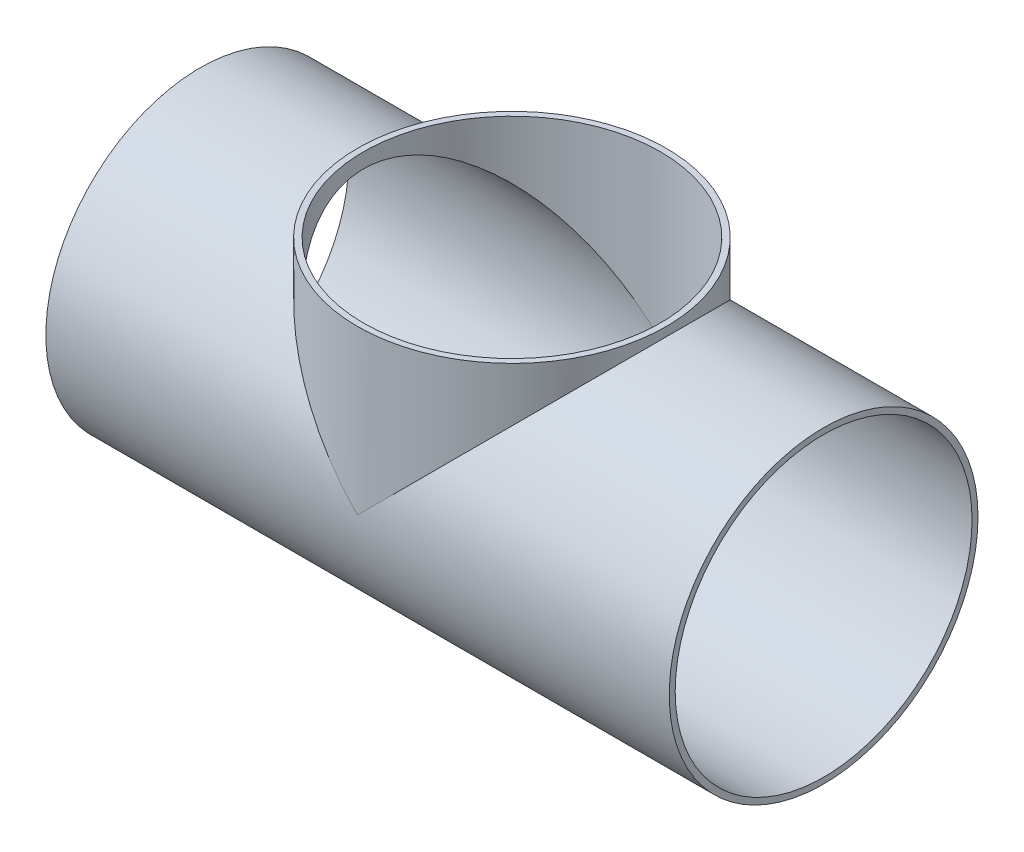
ISO-10303-21;
HEADER;
FILE_DESCRIPTION(('STEP AP214'),'2;1');
FILE_NAME('part.step','',(''),(''),'','','');
FILE_SCHEMA(('AUTOMOTIVE_DESIGN { 1 0 10303 214 1 1 1 1 }'));
ENDSEC;
DATA;
#1=APPLICATION_CONTEXT('core data for automotive mechanical design processes');
#2=APPLICATION_PROTOCOL_DEFINITION('international standard','automotive_design',2000,#1);
#3=PRODUCT_CONTEXT('',#1,'mechanical');
#4=PRODUCT('Part','Part','',(#3));
#5=PRODUCT_RELATED_PRODUCT_CATEGORY('part','',(#4));
#6=PRODUCT_DEFINITION_FORMATION('','',#4);
#7=PRODUCT_DEFINITION_CONTEXT('part definition',#1,'design');
#8=PRODUCT_DEFINITION('design','',#6,#7);
#9=PRODUCT_DEFINITION_SHAPE('','',#8);
#10=(LENGTH_UNIT() NAMED_UNIT(*) SI_UNIT(.MILLI.,.METRE.));
#11=(NAMED_UNIT(*) PLANE_ANGLE_UNIT() SI_UNIT($,.RADIAN.));
#12=(NAMED_UNIT(*) SI_UNIT($,.STERADIAN.) SOLID_ANGLE_UNIT());
#13=UNCERTAINTY_MEASURE_WITH_UNIT(LENGTH_MEASURE(1.E-05),#10,'distance_accuracy_value','');
#14=(GEOMETRIC_REPRESENTATION_CONTEXT(3) GLOBAL_UNCERTAINTY_ASSIGNED_CONTEXT((#13)) GLOBAL_UNIT_ASSIGNED_CONTEXT((#10,
#11,#12)) REPRESENTATION_CONTEXT('',''));
#15=CARTESIAN_POINT('',(0.,0.,0.));
#16=DIRECTION('',(0.,0.,1.));
#17=DIRECTION('',(1.,0.,0.));
#18=AXIS2_PLACEMENT_3D('',#15,#16,#17);
#19=CARTESIAN_POINT('',(0.,0.,0.));
#20=DIRECTION('',(1.,0.,0.));
#21=DIRECTION('',(0.,0.,-1.));
#22=AXIS2_PLACEMENT_3D('',#19,#20,#21);
#23=CYLINDRICAL_SURFACE('',#22,52.);
#24=CARTESIAN_POINT('',(105.,0.,0.));
#25=DIRECTION('',(0.707106781186547,0.707106781186547,0.));
#26=DIRECTION('',(0.707106781186547,-0.707106781186547,0.));
#27=AXIS2_PLACEMENT_3D('',#24,#25,#26);
#28=ELLIPSE('',#27,73.539105243401,52.);
#29=CARTESIAN_POINT('',(105.,0.,-52.));
#30=VERTEX_POINT('',#29);
#31=CARTESIAN_POINT('',(105.,0.,52.));
#32=VERTEX_POINT('',#31);
#33=EDGE_CURVE('E58',#30,#32,#28,.T.);
#34=ORIENTED_EDGE('',*,*,#33,.F.);
#35=CARTESIAN_POINT('',(105.,0.,0.));
#36=DIRECTION('',(0.707106781186547,-0.707106781186547,0.));
#37=DIRECTION('',(0.707106781186547,0.707106781186547,0.));
#38=AXIS2_PLACEMENT_3D('',#35,#36,#37);
#39=ELLIPSE('',#38,73.539105243401,52.);
#40=EDGE_CURVE('E50',#32,#30,#39,.F.);
#41=ORIENTED_EDGE('',*,*,#40,.F.);
#42=EDGE_LOOP('',(#34,#41));
#43=FACE_BOUND('',#42,.T.);
#44=CARTESIAN_POINT('',(0.,0.,0.));
#45=DIRECTION('',(1.,0.,0.));
#46=DIRECTION('',(0.,0.,-1.));
#47=AXIS2_PLACEMENT_3D('',#44,#45,#46);
#48=CIRCLE('',#47,52.);
#49=CARTESIAN_POINT('',(0.,0.,-52.));
#50=VERTEX_POINT('',#49);
#51=EDGE_CURVE('E84',#50,#50,#48,.T.);
#52=ORIENTED_EDGE('',*,*,#51,.T.);
#53=EDGE_LOOP('',(#52));
#54=FACE_BOUND('',#53,.T.);
#55=CARTESIAN_POINT('',(210.,0.,0.));
#56=DIRECTION('',(1.,0.,0.));
#57=DIRECTION('',(0.,0.,-1.));
#58=AXIS2_PLACEMENT_3D('',#55,#56,#57);
#59=CIRCLE('',#58,52.);
#60=CARTESIAN_POINT('',(210.,0.,-52.));
#61=VERTEX_POINT('',#60);
#62=EDGE_CURVE('E81',#61,#61,#59,.T.);
#63=ORIENTED_EDGE('',*,*,#62,.F.);
#64=EDGE_LOOP('',(#63));
#65=FACE_BOUND('',#64,.T.);
#66=ADVANCED_FACE('F32',(#43,#54,#65),#23,.T.);
#67=CARTESIAN_POINT('',(0.,52.,0.));
#68=DIRECTION('',(-1.,0.,0.));
#69=DIRECTION('',(0.,0.,1.));
#70=AXIS2_PLACEMENT_3D('',#67,#68,#69);
#71=PLANE('',#70);
#72=CARTESIAN_POINT('',(0.,0.,0.));
#73=DIRECTION('',(1.,0.,0.));
#74=DIRECTION('',(0.,0.,-1.));
#75=AXIS2_PLACEMENT_3D('',#72,#73,#74);
#76=CIRCLE('',#75,50.);
#77=CARTESIAN_POINT('',(0.,0.,-50.));
#78=VERTEX_POINT('',#77);
#79=EDGE_CURVE('E67',#78,#78,#76,.T.);
#80=ORIENTED_EDGE('',*,*,#79,.T.);
#81=EDGE_LOOP('',(#80));
#82=FACE_BOUND('',#81,.T.);
#83=ORIENTED_EDGE('',*,*,#51,.F.);
#84=EDGE_LOOP('',(#83));
#85=FACE_BOUND('',#84,.T.);
#86=ADVANCED_FACE('F92',(#82,#85),#71,.T.);
#87=CARTESIAN_POINT('',(210.,0.,0.));
#88=DIRECTION('',(1.,0.,0.));
#89=DIRECTION('',(0.,0.,-1.));
#90=AXIS2_PLACEMENT_3D('',#87,#88,#89);
#91=PLANE('',#90);
#92=CARTESIAN_POINT('',(210.,0.,0.));
#93=DIRECTION('',(1.,0.,0.));
#94=DIRECTION('',(0.,0.,-1.));
#95=AXIS2_PLACEMENT_3D('',#92,#93,#94);
#96=CIRCLE('',#95,50.);
#97=CARTESIAN_POINT('',(210.,0.,-50.));
#98=VERTEX_POINT('',#97);
#99=EDGE_CURVE('E70',#98,#98,#96,.T.);
#100=ORIENTED_EDGE('',*,*,#99,.F.);
#101=EDGE_LOOP('',(#100));
#102=FACE_BOUND('',#101,.T.);
#103=ORIENTED_EDGE('',*,*,#62,.T.);
#104=EDGE_LOOP('',(#103));
#105=FACE_BOUND('',#104,.T.);
#106=ADVANCED_FACE('F97',(#102,#105),#91,.T.);
#107=CARTESIAN_POINT('',(105.,55.,0.));
#108=DIRECTION('',(0.,1.,0.));
#109=DIRECTION('',(0.,0.,1.));
#110=AXIS2_PLACEMENT_3D('',#107,#108,#109);
#111=PLANE('',#110);
#112=CARTESIAN_POINT('',(105.,55.,0.));
#113=DIRECTION('',(0.,1.,0.));
#114=DIRECTION('',(0.,0.,1.));
#115=AXIS2_PLACEMENT_3D('',#112,#113,#114);
#116=CIRCLE('',#115,50.);
#117=CARTESIAN_POINT('',(105.,55.,50.));
#118=VERTEX_POINT('',#117);
#119=EDGE_CURVE('E72',#118,#118,#116,.T.);
#120=ORIENTED_EDGE('',*,*,#119,.F.);
#121=EDGE_LOOP('',(#120));
#122=FACE_BOUND('',#121,.T.);
#123=CARTESIAN_POINT('',(105.,55.,0.));
#124=DIRECTION('',(0.,1.,0.));
#125=DIRECTION('',(0.,0.,1.));
#126=AXIS2_PLACEMENT_3D('',#123,#124,#125);
#127=CIRCLE('',#126,52.);
#128=CARTESIAN_POINT('',(105.,55.,52.));
#129=VERTEX_POINT('',#128);
#130=EDGE_CURVE('E74',#129,#129,#127,.T.);
#131=ORIENTED_EDGE('',*,*,#130,.T.);
#132=EDGE_LOOP('',(#131));
#133=FACE_BOUND('',#132,.T.);
#134=ADVANCED_FACE('F99',(#122,#133),#111,.T.);
#135=CARTESIAN_POINT('',(105.,0.,0.));
#136=DIRECTION('',(0.,1.,0.));
#137=DIRECTION('',(0.,0.,1.));
#138=AXIS2_PLACEMENT_3D('',#135,#136,#137);
#139=CYLINDRICAL_SURFACE('',#138,52.);
#140=ORIENTED_EDGE('',*,*,#40,.T.);
#141=ORIENTED_EDGE('',*,*,#33,.T.);
#142=EDGE_LOOP('',(#140,#141));
#143=FACE_BOUND('',#142,.T.);
#144=ORIENTED_EDGE('',*,*,#130,.F.);
#145=EDGE_LOOP('',(#144));
#146=FACE_BOUND('',#145,.T.);
#147=ADVANCED_FACE('F62',(#143,#146),#139,.T.);
#148=CARTESIAN_POINT('',(210.,0.,0.));
#149=DIRECTION('',(1.,0.,0.));
#150=DIRECTION('',(0.,0.,-1.));
#151=AXIS2_PLACEMENT_3D('',#148,#149,#150);
#152=CYLINDRICAL_SURFACE('',#151,50.);
#153=CARTESIAN_POINT('',(105.,0.,0.));
#154=DIRECTION('',(0.707106781186547,-0.707106781186547,0.));
#155=DIRECTION('',(0.707106781186547,0.707106781186547,0.));
#156=AXIS2_PLACEMENT_3D('',#153,#154,#155);
#157=ELLIPSE('',#156,70.7106781186547,50.);
#158=CARTESIAN_POINT('',(105.,0.,50.));
#159=VERTEX_POINT('',#158);
#160=CARTESIAN_POINT('',(105.,0.,-50.));
#161=VERTEX_POINT('',#160);
#162=EDGE_CURVE('E39',#159,#161,#157,.F.);
#163=ORIENTED_EDGE('',*,*,#162,.T.);
#164=CARTESIAN_POINT('',(105.,0.,0.));
#165=DIRECTION('',(0.707106781186547,0.707106781186547,0.));
#166=DIRECTION('',(0.707106781186547,-0.707106781186547,0.));
#167=AXIS2_PLACEMENT_3D('',#164,#165,#166);
#168=ELLIPSE('',#167,70.7106781186547,50.);
#169=EDGE_CURVE('E11',#161,#159,#168,.T.);
#170=ORIENTED_EDGE('',*,*,#169,.T.);
#171=EDGE_LOOP('',(#163,#170));
#172=FACE_BOUND('',#171,.T.);
#173=ORIENTED_EDGE('',*,*,#79,.F.);
#174=EDGE_LOOP('',(#173));
#175=FACE_BOUND('',#174,.T.);
#176=ORIENTED_EDGE('',*,*,#99,.T.);
#177=EDGE_LOOP('',(#176));
#178=FACE_BOUND('',#177,.T.);
#179=ADVANCED_FACE('F59',(#172,#175,#178),#152,.F.);
#180=CARTESIAN_POINT('',(105.,55.,0.));
#181=DIRECTION('',(0.,1.,0.));
#182=DIRECTION('',(0.,0.,1.));
#183=AXIS2_PLACEMENT_3D('',#180,#181,#182);
#184=CYLINDRICAL_SURFACE('',#183,50.);
#185=ORIENTED_EDGE('',*,*,#162,.F.);
#186=ORIENTED_EDGE('',*,*,#169,.F.);
#187=EDGE_LOOP('',(#185,#186));
#188=FACE_BOUND('',#187,.T.);
#189=ORIENTED_EDGE('',*,*,#119,.T.);
#190=EDGE_LOOP('',(#189));
#191=FACE_BOUND('',#190,.T.);
#192=ADVANCED_FACE('F55',(#188,#191),#184,.F.);
#193=CLOSED_SHELL('',(#66,#86,#106,#134,#147,#179,#192));
#194=MANIFOLD_SOLID_BREP('B2',#193);
#195=ADVANCED_BREP_SHAPE_REPRESENTATION('',(#18,#194),#14);
#196=SHAPE_DEFINITION_REPRESENTATION(#9,#195);
ENDSEC;
END-ISO-10303-21;
